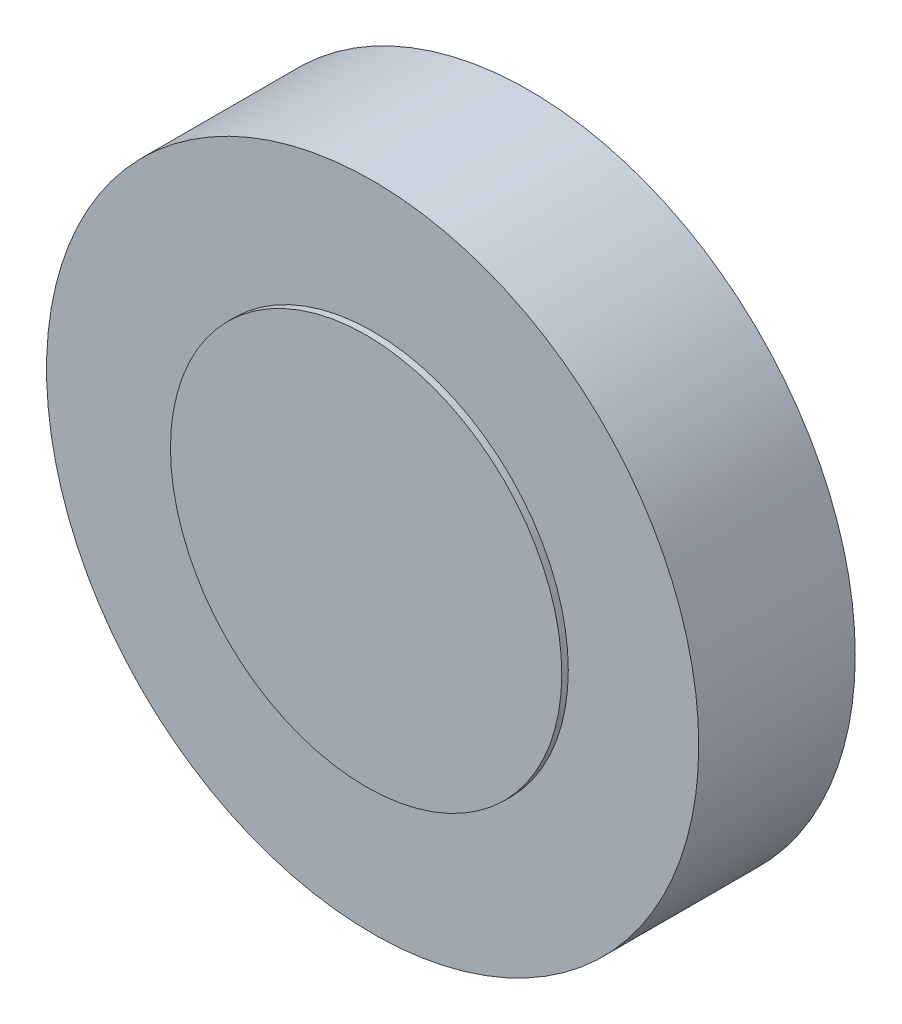
ISO-10303-21;
HEADER;
FILE_DESCRIPTION(('STEP AP214'),'2;1');
FILE_NAME('part.step','',(''),(''),'','','');
FILE_SCHEMA(('AUTOMOTIVE_DESIGN { 1 0 10303 214 1 1 1 1 }'));
ENDSEC;
DATA;
#1=APPLICATION_CONTEXT('core data for automotive mechanical design processes');
#2=APPLICATION_PROTOCOL_DEFINITION('international standard','automotive_design',2000,#1);
#3=PRODUCT_CONTEXT('',#1,'mechanical');
#4=PRODUCT('Part','Part','',(#3));
#5=PRODUCT_RELATED_PRODUCT_CATEGORY('part','',(#4));
#6=PRODUCT_DEFINITION_FORMATION('','',#4);
#7=PRODUCT_DEFINITION_CONTEXT('part definition',#1,'design');
#8=PRODUCT_DEFINITION('design','',#6,#7);
#9=PRODUCT_DEFINITION_SHAPE('','',#8);
#10=(LENGTH_UNIT() NAMED_UNIT(*) SI_UNIT(.MILLI.,.METRE.));
#11=(NAMED_UNIT(*) PLANE_ANGLE_UNIT() SI_UNIT($,.RADIAN.));
#12=(NAMED_UNIT(*) SI_UNIT($,.STERADIAN.) SOLID_ANGLE_UNIT());
#13=UNCERTAINTY_MEASURE_WITH_UNIT(LENGTH_MEASURE(1.E-05),#10,'distance_accuracy_value','');
#14=(GEOMETRIC_REPRESENTATION_CONTEXT(3) GLOBAL_UNCERTAINTY_ASSIGNED_CONTEXT((#13)) GLOBAL_UNIT_ASSIGNED_CONTEXT((#10,
#11,#12)) REPRESENTATION_CONTEXT('',''));
#15=CARTESIAN_POINT('',(0.,0.,0.));
#16=DIRECTION('',(0.,0.,1.));
#17=DIRECTION('',(1.,0.,0.));
#18=AXIS2_PLACEMENT_3D('',#15,#16,#17);
#19=CARTESIAN_POINT('',(0.,0.,0.));
#20=DIRECTION('',(0.,0.,1.));
#21=DIRECTION('',(1.,0.,0.));
#22=AXIS2_PLACEMENT_3D('',#19,#20,#21);
#23=PLANE('',#22);
#24=CARTESIAN_POINT('',(0.,0.,0.));
#25=DIRECTION('',(0.,0.,1.));
#26=DIRECTION('',(1.,0.,0.));
#27=AXIS2_PLACEMENT_3D('',#24,#25,#26);
#28=CIRCLE('',#27,5.);
#29=CARTESIAN_POINT('',(-5.,0.,0.));
#30=VERTEX_POINT('',#29);
#31=CARTESIAN_POINT('',(5.,0.,0.));
#32=VERTEX_POINT('',#31);
#33=EDGE_CURVE('E46',#30,#32,#28,.T.);
#34=ORIENTED_EDGE('',*,*,#33,.F.);
#35=CARTESIAN_POINT('',(0.,0.,0.));
#36=DIRECTION('',(0.,0.,1.));
#37=DIRECTION('',(1.,0.,0.));
#38=AXIS2_PLACEMENT_3D('',#35,#36,#37);
#39=CIRCLE('',#38,5.);
#40=EDGE_CURVE('E72',#32,#30,#39,.T.);
#41=ORIENTED_EDGE('',*,*,#40,.F.);
#42=EDGE_LOOP('',(#34,#41));
#43=FACE_BOUND('',#42,.T.);
#44=ADVANCED_FACE('F38',(#43),#23,.F.);
#45=CARTESIAN_POINT('',(0.,0.,2.));
#46=DIRECTION('',(0.,0.,-1.));
#47=DIRECTION('',(-1.,0.,0.));
#48=AXIS2_PLACEMENT_3D('',#45,#46,#47);
#49=CYLINDRICAL_SURFACE('',#48,5.);
#50=DIRECTION('',(0.,0.,-1.));
#51=VECTOR('',#50,1.);
#52=CARTESIAN_POINT('',(-5.,0.,2.));
#53=LINE('',#52,#51);
#54=CARTESIAN_POINT('',(-5.,0.,2.));
#55=VERTEX_POINT('',#54);
#56=EDGE_CURVE('E68',#55,#30,#53,.T.);
#57=ORIENTED_EDGE('',*,*,#56,.F.);
#58=ORIENTED_EDGE('',*,*,#56,.T.);
#59=ORIENTED_EDGE('',*,*,#33,.T.);
#60=DIRECTION('',(0.,0.,-1.));
#61=VECTOR('',#60,1.);
#62=CARTESIAN_POINT('',(5.,0.,2.));
#63=LINE('',#62,#61);
#64=CARTESIAN_POINT('',(5.,0.,2.));
#65=VERTEX_POINT('',#64);
#66=EDGE_CURVE('E79',#65,#32,#63,.T.);
#67=ORIENTED_EDGE('',*,*,#66,.F.);
#68=ORIENTED_EDGE('',*,*,#66,.T.);
#69=ORIENTED_EDGE('',*,*,#40,.T.);
#70=EDGE_LOOP('',(#57,#58,#59,#67,#68,#69));
#71=FACE_BOUND('',#70,.T.);
#72=CARTESIAN_POINT('',(0.,0.,2.4));
#73=DIRECTION('',(0.,0.,1.));
#74=DIRECTION('',(1.,0.,0.));
#75=AXIS2_PLACEMENT_3D('',#72,#73,#74);
#76=CIRCLE('',#75,5.);
#77=CARTESIAN_POINT('',(5.,0.,2.4));
#78=VERTEX_POINT('',#77);
#79=EDGE_CURVE('E84',#78,#78,#76,.T.);
#80=ORIENTED_EDGE('',*,*,#79,.F.);
#81=EDGE_LOOP('',(#80));
#82=FACE_BOUND('',#81,.T.);
#83=ADVANCED_FACE('F69',(#71,#82),#49,.T.);
#84=CARTESIAN_POINT('',(0.,0.,2.4));
#85=DIRECTION('',(0.,0.,1.));
#86=DIRECTION('',(1.,0.,0.));
#87=AXIS2_PLACEMENT_3D('',#84,#85,#86);
#88=PLANE('',#87);
#89=CARTESIAN_POINT('',(0.,0.,2.4));
#90=DIRECTION('',(0.,0.,1.));
#91=DIRECTION('',(1.,0.,0.));
#92=AXIS2_PLACEMENT_3D('',#89,#90,#91);
#93=CIRCLE('',#92,3.);
#94=CARTESIAN_POINT('',(3.,0.,2.4));
#95=VERTEX_POINT('',#94);
#96=EDGE_CURVE('E11',#95,#95,#93,.T.);
#97=ORIENTED_EDGE('',*,*,#96,.F.);
#98=EDGE_LOOP('',(#97));
#99=FACE_BOUND('',#98,.T.);
#100=ORIENTED_EDGE('',*,*,#79,.T.);
#101=EDGE_LOOP('',(#100));
#102=FACE_BOUND('',#101,.T.);
#103=ADVANCED_FACE('F100',(#99,#102),#88,.T.);
#104=CARTESIAN_POINT('',(0.,0.,2.5));
#105=DIRECTION('',(0.,0.,-1.));
#106=DIRECTION('',(-1.,0.,0.));
#107=AXIS2_PLACEMENT_3D('',#104,#105,#106);
#108=CYLINDRICAL_SURFACE('',#107,3.);
#109=CARTESIAN_POINT('',(0.,0.,2.5));
#110=DIRECTION('',(0.,0.,1.));
#111=DIRECTION('',(1.,0.,0.));
#112=AXIS2_PLACEMENT_3D('',#109,#110,#111);
#113=CIRCLE('',#112,3.);
#114=CARTESIAN_POINT('',(3.,0.,2.5));
#115=VERTEX_POINT('',#114);
#116=EDGE_CURVE('E87',#115,#115,#113,.T.);
#117=ORIENTED_EDGE('',*,*,#116,.F.);
#118=EDGE_LOOP('',(#117));
#119=FACE_BOUND('',#118,.T.);
#120=ORIENTED_EDGE('',*,*,#96,.T.);
#121=EDGE_LOOP('',(#120));
#122=FACE_BOUND('',#121,.T.);
#123=ADVANCED_FACE('F97',(#119,#122),#108,.T.);
#124=CARTESIAN_POINT('',(0.,0.,2.5));
#125=DIRECTION('',(0.,0.,1.));
#126=DIRECTION('',(1.,0.,0.));
#127=AXIS2_PLACEMENT_3D('',#124,#125,#126);
#128=PLANE('',#127);
#129=ORIENTED_EDGE('',*,*,#116,.T.);
#130=EDGE_LOOP('',(#129));
#131=FACE_BOUND('',#130,.T.);
#132=ADVANCED_FACE('F95',(#131),#128,.T.);
#133=CLOSED_SHELL('',(#44,#83,#103,#123,#132));
#134=MANIFOLD_SOLID_BREP('B2',#133);
#135=ADVANCED_BREP_SHAPE_REPRESENTATION('',(#18,#134),#14);
#136=SHAPE_DEFINITION_REPRESENTATION(#9,#135);
ENDSEC;
END-ISO-10303-21;
